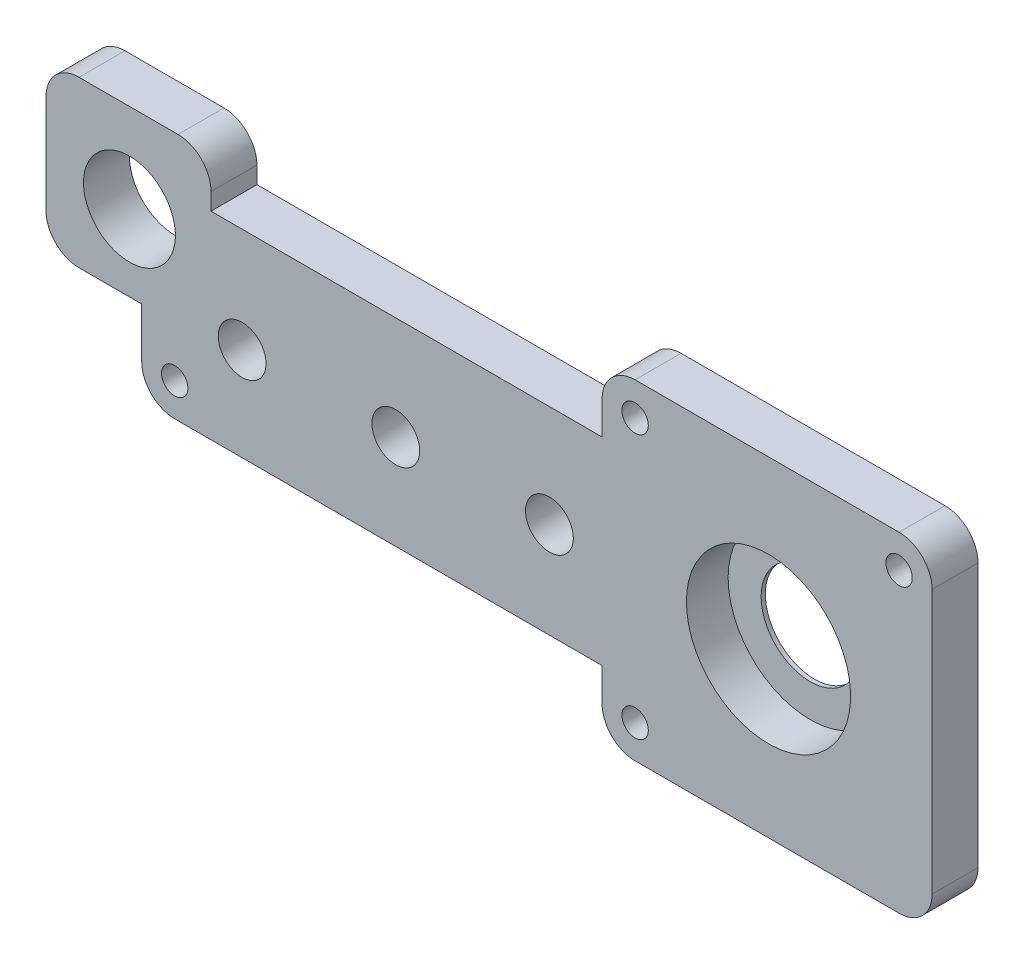
ISO-10303-21;
HEADER;
FILE_DESCRIPTION(('STEP AP214'),'2;1');
FILE_NAME('part.step','',(''),(''),'','','');
FILE_SCHEMA(('AUTOMOTIVE_DESIGN { 1 0 10303 214 1 1 1 1 }'));
ENDSEC;
DATA;
#1=APPLICATION_CONTEXT('core data for automotive mechanical design processes');
#2=APPLICATION_PROTOCOL_DEFINITION('international standard','automotive_design',2000,#1);
#3=PRODUCT_CONTEXT('',#1,'mechanical');
#4=PRODUCT('Part','Part','',(#3));
#5=PRODUCT_RELATED_PRODUCT_CATEGORY('part','',(#4));
#6=PRODUCT_DEFINITION_FORMATION('','',#4);
#7=PRODUCT_DEFINITION_CONTEXT('part definition',#1,'design');
#8=PRODUCT_DEFINITION('design','',#6,#7);
#9=PRODUCT_DEFINITION_SHAPE('','',#8);
#10=(LENGTH_UNIT() NAMED_UNIT(*) SI_UNIT(.MILLI.,.METRE.));
#11=(NAMED_UNIT(*) PLANE_ANGLE_UNIT() SI_UNIT($,.RADIAN.));
#12=(NAMED_UNIT(*) SI_UNIT($,.STERADIAN.) SOLID_ANGLE_UNIT());
#13=UNCERTAINTY_MEASURE_WITH_UNIT(LENGTH_MEASURE(1.E-05),#10,'distance_accuracy_value','');
#14=(GEOMETRIC_REPRESENTATION_CONTEXT(3) GLOBAL_UNCERTAINTY_ASSIGNED_CONTEXT((#13)) GLOBAL_UNIT_ASSIGNED_CONTEXT((#10,
#11,#12)) REPRESENTATION_CONTEXT('',''));
#15=CARTESIAN_POINT('',(0.,0.,0.));
#16=DIRECTION('',(0.,0.,1.));
#17=DIRECTION('',(1.,0.,0.));
#18=AXIS2_PLACEMENT_3D('',#15,#16,#17);
#19=CARTESIAN_POINT('',(-32.4507678390087,6.02727293338606,0.));
#20=DIRECTION('',(0.,0.,1.));
#21=DIRECTION('',(1.,0.,0.));
#22=AXIS2_PLACEMENT_3D('',#19,#20,#21);
#23=PLANE('',#22);
#24=CARTESIAN_POINT('',(36.9297953037845,7.56944328648019,0.));
#25=DIRECTION('',(0.,0.,-1.));
#26=DIRECTION('',(-1.,0.,0.));
#27=AXIS2_PLACEMENT_3D('',#24,#25,#26);
#28=CIRCLE('',#27,1.27000000000001);
#29=CARTESIAN_POINT('',(35.6597953037845,7.56944328648019,0.));
#30=VERTEX_POINT('',#29);
#31=EDGE_CURVE('E386',#30,#30,#28,.T.);
#32=ORIENTED_EDGE('',*,*,#31,.T.);
#33=EDGE_LOOP('',(#32));
#34=FACE_BOUND('',#33,.T.);
#35=CARTESIAN_POINT('',(11.5297953037845,-17.8305567135198,0.));
#36=DIRECTION('',(0.,0.,-1.));
#37=DIRECTION('',(-1.,0.,0.));
#38=AXIS2_PLACEMENT_3D('',#35,#36,#37);
#39=CIRCLE('',#38,1.27);
#40=CARTESIAN_POINT('',(10.2597953037845,-17.8305567135198,0.));
#41=VERTEX_POINT('',#40);
#42=EDGE_CURVE('E397',#41,#41,#39,.T.);
#43=ORIENTED_EDGE('',*,*,#42,.T.);
#44=EDGE_LOOP('',(#43));
#45=FACE_BOUND('',#44,.T.);
#46=CARTESIAN_POINT('',(3.28591546503794,-5.43259216122547,0.));
#47=DIRECTION('',(0.,0.,-1.));
#48=DIRECTION('',(-1.,0.,0.));
#49=AXIS2_PLACEMENT_3D('',#46,#47,#48);
#50=CIRCLE('',#49,2.2987);
#51=CARTESIAN_POINT('',(0.987215465037943,-5.43259216122547,0.));
#52=VERTEX_POINT('',#51);
#53=EDGE_CURVE('E409',#52,#52,#50,.T.);
#54=ORIENTED_EDGE('',*,*,#53,.T.);
#55=EDGE_LOOP('',(#54));
#56=FACE_BOUND('',#55,.T.);
#57=CARTESIAN_POINT('',(-26.278771935371,-5.66488997890497,0.));
#58=DIRECTION('',(0.,0.,-1.));
#59=DIRECTION('',(-1.,0.,0.));
#60=AXIS2_PLACEMENT_3D('',#57,#58,#59);
#61=CIRCLE('',#60,2.2987);
#62=CARTESIAN_POINT('',(-28.577471935371,-5.66488997890497,0.));
#63=VERTEX_POINT('',#62);
#64=EDGE_CURVE('E421',#63,#63,#61,.T.);
#65=ORIENTED_EDGE('',*,*,#64,.T.);
#66=EDGE_LOOP('',(#65));
#67=FACE_BOUND('',#66,.T.);
#68=CARTESIAN_POINT('',(-32.4507678390087,6.02727293338606,0.));
#69=DIRECTION('',(0.,0.,1.));
#70=DIRECTION('',(1.,0.,0.));
#71=AXIS2_PLACEMENT_3D('',#68,#69,#70);
#72=CIRCLE('',#71,3.175);
#73=CARTESIAN_POINT('',(-29.2757678390087,6.02727293338604,0.));
#74=VERTEX_POINT('',#73);
#75=CARTESIAN_POINT('',(-32.4507678390088,9.20227293338606,0.));
#76=VERTEX_POINT('',#75);
#77=EDGE_CURVE('E207',#74,#76,#72,.T.);
#78=ORIENTED_EDGE('',*,*,#77,.T.);
#79=DIRECTION('',(-1.,0.,0.));
#80=VECTOR('',#79,1.);
#81=CARTESIAN_POINT('',(-32.4507678390088,9.20227293338606,0.));
#82=LINE('',#81,#80);
#83=CARTESIAN_POINT('',(-41.9757678390087,9.20227293338606,0.));
#84=VERTEX_POINT('',#83);
#85=EDGE_CURVE('E210',#76,#84,#82,.T.);
#86=ORIENTED_EDGE('',*,*,#85,.T.);
#87=CARTESIAN_POINT('',(-41.9757678390087,6.02727293338606,0.));
#88=DIRECTION('',(0.,0.,1.));
#89=DIRECTION('',(1.,0.,0.));
#90=AXIS2_PLACEMENT_3D('',#87,#88,#89);
#91=CIRCLE('',#90,3.175);
#92=CARTESIAN_POINT('',(-45.1507678390087,6.02727293338604,0.));
#93=VERTEX_POINT('',#92);
#94=EDGE_CURVE('E214',#84,#93,#91,.T.);
#95=ORIENTED_EDGE('',*,*,#94,.T.);
#96=DIRECTION('',(0.,-1.,0.));
#97=VECTOR('',#96,1.);
#98=CARTESIAN_POINT('',(-45.1507678390087,6.02727293338604,0.));
#99=LINE('',#98,#97);
#100=CARTESIAN_POINT('',(-45.1507678390087,-3.49772706661392,0.));
#101=VERTEX_POINT('',#100);
#102=EDGE_CURVE('E217',#93,#101,#99,.T.);
#103=ORIENTED_EDGE('',*,*,#102,.T.);
#104=CARTESIAN_POINT('',(-41.9757678390087,-3.49772706661394,0.));
#105=DIRECTION('',(0.,0.,1.));
#106=DIRECTION('',(1.,0.,0.));
#107=AXIS2_PLACEMENT_3D('',#104,#105,#106);
#108=CIRCLE('',#107,3.175);
#109=CARTESIAN_POINT('',(-41.9757678390087,-6.67272706661394,0.));
#110=VERTEX_POINT('',#109);
#111=EDGE_CURVE('E220',#101,#110,#108,.T.);
#112=ORIENTED_EDGE('',*,*,#111,.T.);
#113=DIRECTION('',(1.,0.,0.));
#114=VECTOR('',#113,1.);
#115=CARTESIAN_POINT('',(-41.9757678390087,-6.67272706661394,0.));
#116=LINE('',#115,#114);
#117=CARTESIAN_POINT('',(-35.9428046962155,-6.67272706661394,0.));
#118=VERTEX_POINT('',#117);
#119=EDGE_CURVE('E223',#110,#118,#116,.T.);
#120=ORIENTED_EDGE('',*,*,#119,.T.);
#121=DIRECTION('',(0.,-1.,0.));
#122=VECTOR('',#121,1.);
#123=CARTESIAN_POINT('',(-35.9428046962155,-6.67272706661394,0.));
#124=LINE('',#123,#122);
#125=CARTESIAN_POINT('',(-35.9428046962155,-11.4805567135198,0.));
#126=VERTEX_POINT('',#125);
#127=EDGE_CURVE('E226',#118,#126,#124,.T.);
#128=ORIENTED_EDGE('',*,*,#127,.T.);
#129=CARTESIAN_POINT('',(-32.7678046962155,-11.4805567135198,0.));
#130=DIRECTION('',(0.,0.,1.));
#131=DIRECTION('',(1.,0.,0.));
#132=AXIS2_PLACEMENT_3D('',#129,#130,#131);
#133=CIRCLE('',#132,3.175);
#134=CARTESIAN_POINT('',(-32.7678046962155,-14.6555567135198,0.));
#135=VERTEX_POINT('',#134);
#136=EDGE_CURVE('E229',#126,#135,#133,.T.);
#137=ORIENTED_EDGE('',*,*,#136,.T.);
#138=DIRECTION('',(1.,0.,0.));
#139=VECTOR('',#138,1.);
#140=CARTESIAN_POINT('',(-32.7678046962155,-14.6555567135198,0.));
#141=LINE('',#140,#139);
#142=CARTESIAN_POINT('',(8.35479530378449,-14.6555567135198,0.));
#143=VERTEX_POINT('',#142);
#144=EDGE_CURVE('E232',#135,#143,#141,.T.);
#145=ORIENTED_EDGE('',*,*,#144,.T.);
#146=DIRECTION('',(0.,-1.,0.));
#147=VECTOR('',#146,1.);
#148=CARTESIAN_POINT('',(8.35479530378449,-14.6555567135198,0.));
#149=LINE('',#148,#147);
#150=CARTESIAN_POINT('',(8.3547953037845,-17.8305567135198,0.));
#151=VERTEX_POINT('',#150);
#152=EDGE_CURVE('E235',#143,#151,#149,.T.);
#153=ORIENTED_EDGE('',*,*,#152,.T.);
#154=CARTESIAN_POINT('',(11.5297953037845,-17.8305567135198,0.));
#155=DIRECTION('',(0.,0.,1.));
#156=DIRECTION('',(1.,0.,0.));
#157=AXIS2_PLACEMENT_3D('',#154,#155,#156);
#158=CIRCLE('',#157,3.175);
#159=CARTESIAN_POINT('',(11.5297953037845,-21.0055567135198,0.));
#160=VERTEX_POINT('',#159);
#161=EDGE_CURVE('E238',#151,#160,#158,.T.);
#162=ORIENTED_EDGE('',*,*,#161,.T.);
#163=DIRECTION('',(1.,0.,0.));
#164=VECTOR('',#163,1.);
#165=CARTESIAN_POINT('',(11.5297953037845,-21.0055567135198,0.));
#166=LINE('',#165,#164);
#167=CARTESIAN_POINT('',(36.9297953037845,-21.0055567135198,0.));
#168=VERTEX_POINT('',#167);
#169=EDGE_CURVE('E241',#160,#168,#166,.T.);
#170=ORIENTED_EDGE('',*,*,#169,.T.);
#171=CARTESIAN_POINT('',(36.9297953037845,-17.8305567135198,0.));
#172=DIRECTION('',(0.,0.,1.));
#173=DIRECTION('',(1.,0.,0.));
#174=AXIS2_PLACEMENT_3D('',#171,#172,#173);
#175=CIRCLE('',#174,3.175);
#176=CARTESIAN_POINT('',(40.1047953037845,-17.8305567135198,0.));
#177=VERTEX_POINT('',#176);
#178=EDGE_CURVE('E244',#168,#177,#175,.T.);
#179=ORIENTED_EDGE('',*,*,#178,.T.);
#180=DIRECTION('',(0.,1.,0.));
#181=VECTOR('',#180,1.);
#182=CARTESIAN_POINT('',(40.1047953037845,-17.8305567135198,0.));
#183=LINE('',#182,#181);
#184=CARTESIAN_POINT('',(40.1047953037845,7.56944328648017,0.));
#185=VERTEX_POINT('',#184);
#186=EDGE_CURVE('E247',#177,#185,#183,.T.);
#187=ORIENTED_EDGE('',*,*,#186,.T.);
#188=CARTESIAN_POINT('',(36.9297953037845,7.56944328648019,0.));
#189=DIRECTION('',(0.,0.,1.));
#190=DIRECTION('',(1.,0.,0.));
#191=AXIS2_PLACEMENT_3D('',#188,#189,#190);
#192=CIRCLE('',#191,3.175);
#193=CARTESIAN_POINT('',(36.9297953037845,10.7444432864802,0.));
#194=VERTEX_POINT('',#193);
#195=EDGE_CURVE('E250',#185,#194,#192,.T.);
#196=ORIENTED_EDGE('',*,*,#195,.T.);
#197=DIRECTION('',(-1.,0.,0.));
#198=VECTOR('',#197,1.);
#199=CARTESIAN_POINT('',(36.9297953037845,10.7444432864802,0.));
#200=LINE('',#199,#198);
#201=CARTESIAN_POINT('',(11.5297953037845,10.7444432864802,0.));
#202=VERTEX_POINT('',#201);
#203=EDGE_CURVE('E253',#194,#202,#200,.T.);
#204=ORIENTED_EDGE('',*,*,#203,.T.);
#205=CARTESIAN_POINT('',(11.5297953037845,7.56944328648019,0.));
#206=DIRECTION('',(0.,0.,1.));
#207=DIRECTION('',(1.,0.,0.));
#208=AXIS2_PLACEMENT_3D('',#205,#206,#207);
#209=CIRCLE('',#208,3.175);
#210=CARTESIAN_POINT('',(8.3547953037845,7.56944328648018,0.));
#211=VERTEX_POINT('',#210);
#212=EDGE_CURVE('E256',#202,#211,#209,.T.);
#213=ORIENTED_EDGE('',*,*,#212,.T.);
#214=DIRECTION('',(0.,-1.,0.));
#215=VECTOR('',#214,1.);
#216=CARTESIAN_POINT('',(8.3547953037845,7.56944328648018,0.));
#217=LINE('',#216,#215);
#218=CARTESIAN_POINT('',(8.3547953037845,4.39444328648021,0.));
#219=VERTEX_POINT('',#218);
#220=EDGE_CURVE('E259',#211,#219,#217,.T.);
#221=ORIENTED_EDGE('',*,*,#220,.T.);
#222=DIRECTION('',(-1.,0.,0.));
#223=VECTOR('',#222,1.);
#224=CARTESIAN_POINT('',(8.3547953037845,4.39444328648021,0.));
#225=LINE('',#224,#223);
#226=CARTESIAN_POINT('',(-29.2757678390087,4.39444328648021,0.));
#227=VERTEX_POINT('',#226);
#228=EDGE_CURVE('E183',#219,#227,#225,.T.);
#229=ORIENTED_EDGE('',*,*,#228,.T.);
#230=DIRECTION('',(0.,1.,0.));
#231=VECTOR('',#230,1.);
#232=CARTESIAN_POINT('',(-29.2757678390087,4.39444328648021,0.));
#233=LINE('',#232,#231);
#234=EDGE_CURVE('E262',#227,#74,#233,.T.);
#235=ORIENTED_EDGE('',*,*,#234,.T.);
#236=EDGE_LOOP('',(#78,#86,#95,#103,#112,#120,#128,#137,#145,#153,#162,#170,#179,#187,#196,#204,
#213,#221,#229,#235));
#237=FACE_BOUND('',#236,.T.);
#238=CARTESIAN_POINT('',(24.3672647282162,-5.26695024655708,0.));
#239=DIRECTION('',(0.,0.,-1.));
#240=DIRECTION('',(-1.,0.,0.));
#241=AXIS2_PLACEMENT_3D('',#238,#239,#240);
#242=CIRCLE('',#241,7.8994);
#243=CARTESIAN_POINT('',(16.4678647282162,-5.26695024655708,0.));
#244=VERTEX_POINT('',#243);
#245=EDGE_CURVE('E427',#244,#244,#242,.T.);
#246=ORIENTED_EDGE('',*,*,#245,.T.);
#247=EDGE_LOOP('',(#246));
#248=FACE_BOUND('',#247,.T.);
#249=CARTESIAN_POINT('',(-11.4964282351665,-5.54874107006524,0.));
#250=DIRECTION('',(0.,0.,-1.));
#251=DIRECTION('',(-1.,0.,0.));
#252=AXIS2_PLACEMENT_3D('',#249,#250,#251);
#253=CIRCLE('',#252,2.2987);
#254=CARTESIAN_POINT('',(-13.7951282351665,-5.54874107006524,0.));
#255=VERTEX_POINT('',#254);
#256=EDGE_CURVE('E415',#255,#255,#253,.T.);
#257=ORIENTED_EDGE('',*,*,#256,.T.);
#258=EDGE_LOOP('',(#257));
#259=FACE_BOUND('',#258,.T.);
#260=CARTESIAN_POINT('',(-32.7678046962155,-11.4805567135198,0.));
#261=DIRECTION('',(0.,0.,-1.));
#262=DIRECTION('',(-1.,0.,0.));
#263=AXIS2_PLACEMENT_3D('',#260,#261,#262);
#264=CIRCLE('',#263,1.27000000000001);
#265=CARTESIAN_POINT('',(-34.0378046962155,-11.4805567135198,0.));
#266=VERTEX_POINT('',#265);
#267=EDGE_CURVE('E403',#266,#266,#264,.T.);
#268=ORIENTED_EDGE('',*,*,#267,.T.);
#269=EDGE_LOOP('',(#268));
#270=FACE_BOUND('',#269,.T.);
#271=CARTESIAN_POINT('',(11.5297953037845,7.56944328648019,0.));
#272=DIRECTION('',(0.,0.,-1.));
#273=DIRECTION('',(-1.,0.,0.));
#274=AXIS2_PLACEMENT_3D('',#271,#272,#273);
#275=CIRCLE('',#274,1.27);
#276=CARTESIAN_POINT('',(10.2597953037845,7.56944328648019,0.));
#277=VERTEX_POINT('',#276);
#278=EDGE_CURVE('E392',#277,#277,#275,.T.);
#279=ORIENTED_EDGE('',*,*,#278,.T.);
#280=EDGE_LOOP('',(#279));
#281=FACE_BOUND('',#280,.T.);
#282=CARTESIAN_POINT('',(-37.1241501546406,0.645421981766471,0.));
#283=DIRECTION('',(0.,0.,-1.));
#284=DIRECTION('',(-1.,0.,0.));
#285=AXIS2_PLACEMENT_3D('',#282,#283,#284);
#286=CIRCLE('',#285,4.4196);
#287=CARTESIAN_POINT('',(-41.5437501546406,0.645421981766471,0.));
#288=VERTEX_POINT('',#287);
#289=EDGE_CURVE('E383',#288,#288,#286,.T.);
#290=ORIENTED_EDGE('',*,*,#289,.T.);
#291=EDGE_LOOP('',(#290));
#292=FACE_BOUND('',#291,.T.);
#293=ADVANCED_FACE('F35',(#34,#45,#56,#67,#237,#248,#259,#270,#281,#292),#23,.T.);
#294=CARTESIAN_POINT('',(-32.4507678390087,6.02727293338606,-4.4196));
#295=DIRECTION('',(0.,0.,1.));
#296=DIRECTION('',(1.,0.,0.));
#297=AXIS2_PLACEMENT_3D('',#294,#295,#296);
#298=PLANE('',#297);
#299=CARTESIAN_POINT('',(36.9297953037845,7.56944328648019,-4.4196));
#300=DIRECTION('',(0.,0.,-1.));
#301=DIRECTION('',(-1.,0.,0.));
#302=AXIS2_PLACEMENT_3D('',#299,#300,#301);
#303=CIRCLE('',#302,1.27000000000001);
#304=CARTESIAN_POINT('',(35.6597953037845,7.56944328648019,-4.4196));
#305=VERTEX_POINT('',#304);
#306=EDGE_CURVE('E389',#305,#305,#303,.T.);
#307=ORIENTED_EDGE('',*,*,#306,.F.);
#308=EDGE_LOOP('',(#307));
#309=FACE_BOUND('',#308,.T.);
#310=CARTESIAN_POINT('',(11.5297953037845,-17.8305567135198,-4.4196));
#311=DIRECTION('',(0.,0.,-1.));
#312=DIRECTION('',(-1.,0.,0.));
#313=AXIS2_PLACEMENT_3D('',#310,#311,#312);
#314=CIRCLE('',#313,1.27);
#315=CARTESIAN_POINT('',(10.2597953037845,-17.8305567135198,-4.4196));
#316=VERTEX_POINT('',#315);
#317=EDGE_CURVE('E400',#316,#316,#314,.T.);
#318=ORIENTED_EDGE('',*,*,#317,.F.);
#319=EDGE_LOOP('',(#318));
#320=FACE_BOUND('',#319,.T.);
#321=CARTESIAN_POINT('',(-32.4507678390087,6.02727293338606,-4.4196));
#322=DIRECTION('',(0.,0.,1.));
#323=DIRECTION('',(1.,0.,0.));
#324=AXIS2_PLACEMENT_3D('',#321,#322,#323);
#325=CIRCLE('',#324,3.175);
#326=CARTESIAN_POINT('',(-29.2757678390087,6.02727293338604,-4.4196));
#327=VERTEX_POINT('',#326);
#328=CARTESIAN_POINT('',(-32.4507678390088,9.20227293338606,-4.4196));
#329=VERTEX_POINT('',#328);
#330=EDGE_CURVE('E264',#327,#329,#325,.T.);
#331=ORIENTED_EDGE('',*,*,#330,.F.);
#332=DIRECTION('',(0.,1.,0.));
#333=VECTOR('',#332,1.);
#334=CARTESIAN_POINT('',(-29.2757678390087,4.39444328648021,-4.4196));
#335=LINE('',#334,#333);
#336=CARTESIAN_POINT('',(-29.2757678390087,4.39444328648021,-4.4196));
#337=VERTEX_POINT('',#336);
#338=EDGE_CURVE('E197',#337,#327,#335,.T.);
#339=ORIENTED_EDGE('',*,*,#338,.F.);
#340=DIRECTION('',(-1.,0.,0.));
#341=VECTOR('',#340,1.);
#342=CARTESIAN_POINT('',(8.3547953037845,4.39444328648021,-4.4196));
#343=LINE('',#342,#341);
#344=CARTESIAN_POINT('',(8.3547953037845,4.39444328648021,-4.4196));
#345=VERTEX_POINT('',#344);
#346=EDGE_CURVE('E181',#345,#337,#343,.T.);
#347=ORIENTED_EDGE('',*,*,#346,.F.);
#348=DIRECTION('',(0.,-1.,0.));
#349=VECTOR('',#348,1.);
#350=CARTESIAN_POINT('',(8.3547953037845,7.56944328648018,-4.4196));
#351=LINE('',#350,#349);
#352=CARTESIAN_POINT('',(8.3547953037845,7.56944328648018,-4.4196));
#353=VERTEX_POINT('',#352);
#354=EDGE_CURVE('E195',#353,#345,#351,.T.);
#355=ORIENTED_EDGE('',*,*,#354,.F.);
#356=CARTESIAN_POINT('',(11.5297953037845,7.56944328648019,-4.4196));
#357=DIRECTION('',(0.,0.,1.));
#358=DIRECTION('',(1.,0.,0.));
#359=AXIS2_PLACEMENT_3D('',#356,#357,#358);
#360=CIRCLE('',#359,3.175);
#361=CARTESIAN_POINT('',(11.5297953037845,10.7444432864802,-4.4196));
#362=VERTEX_POINT('',#361);
#363=EDGE_CURVE('E200',#362,#353,#360,.T.);
#364=ORIENTED_EDGE('',*,*,#363,.F.);
#365=DIRECTION('',(-1.,0.,0.));
#366=VECTOR('',#365,1.);
#367=CARTESIAN_POINT('',(36.9297953037845,10.7444432864802,-4.4196));
#368=LINE('',#367,#366);
#369=CARTESIAN_POINT('',(36.9297953037845,10.7444432864802,-4.4196));
#370=VERTEX_POINT('',#369);
#371=EDGE_CURVE('E202',#370,#362,#368,.T.);
#372=ORIENTED_EDGE('',*,*,#371,.F.);
#373=CARTESIAN_POINT('',(36.9297953037845,7.56944328648019,-4.4196));
#374=DIRECTION('',(0.,0.,1.));
#375=DIRECTION('',(1.,0.,0.));
#376=AXIS2_PLACEMENT_3D('',#373,#374,#375);
#377=CIRCLE('',#376,3.175);
#378=CARTESIAN_POINT('',(40.1047953037845,7.56944328648017,-4.4196));
#379=VERTEX_POINT('',#378);
#380=EDGE_CURVE('E476',#379,#370,#377,.T.);
#381=ORIENTED_EDGE('',*,*,#380,.F.);
#382=DIRECTION('',(0.,1.,0.));
#383=VECTOR('',#382,1.);
#384=CARTESIAN_POINT('',(40.1047953037845,-17.8305567135198,-4.4196));
#385=LINE('',#384,#383);
#386=CARTESIAN_POINT('',(40.1047953037845,-17.8305567135198,-4.4196));
#387=VERTEX_POINT('',#386);
#388=EDGE_CURVE('E473',#387,#379,#385,.T.);
#389=ORIENTED_EDGE('',*,*,#388,.F.);
#390=CARTESIAN_POINT('',(36.9297953037845,-17.8305567135198,-4.4196));
#391=DIRECTION('',(0.,0.,1.));
#392=DIRECTION('',(1.,0.,0.));
#393=AXIS2_PLACEMENT_3D('',#390,#391,#392);
#394=CIRCLE('',#393,3.175);
#395=CARTESIAN_POINT('',(36.9297953037845,-21.0055567135198,-4.4196));
#396=VERTEX_POINT('',#395);
#397=EDGE_CURVE('E470',#396,#387,#394,.T.);
#398=ORIENTED_EDGE('',*,*,#397,.F.);
#399=DIRECTION('',(1.,0.,0.));
#400=VECTOR('',#399,1.);
#401=CARTESIAN_POINT('',(11.5297953037845,-21.0055567135198,-4.4196));
#402=LINE('',#401,#400);
#403=CARTESIAN_POINT('',(11.5297953037845,-21.0055567135198,-4.4196));
#404=VERTEX_POINT('',#403);
#405=EDGE_CURVE('E467',#404,#396,#402,.T.);
#406=ORIENTED_EDGE('',*,*,#405,.F.);
#407=CARTESIAN_POINT('',(11.5297953037845,-17.8305567135198,-4.4196));
#408=DIRECTION('',(0.,0.,1.));
#409=DIRECTION('',(1.,0.,0.));
#410=AXIS2_PLACEMENT_3D('',#407,#408,#409);
#411=CIRCLE('',#410,3.175);
#412=CARTESIAN_POINT('',(8.3547953037845,-17.8305567135198,-4.4196));
#413=VERTEX_POINT('',#412);
#414=EDGE_CURVE('E464',#413,#404,#411,.T.);
#415=ORIENTED_EDGE('',*,*,#414,.F.);
#416=DIRECTION('',(0.,-1.,0.));
#417=VECTOR('',#416,1.);
#418=CARTESIAN_POINT('',(8.35479530378449,-14.6555567135198,-4.4196));
#419=LINE('',#418,#417);
#420=CARTESIAN_POINT('',(8.35479530378449,-14.6555567135198,-4.4196));
#421=VERTEX_POINT('',#420);
#422=EDGE_CURVE('E461',#421,#413,#419,.T.);
#423=ORIENTED_EDGE('',*,*,#422,.F.);
#424=DIRECTION('',(1.,0.,0.));
#425=VECTOR('',#424,1.);
#426=CARTESIAN_POINT('',(-32.7678046962155,-14.6555567135198,-4.4196));
#427=LINE('',#426,#425);
#428=CARTESIAN_POINT('',(-32.7678046962155,-14.6555567135198,-4.4196));
#429=VERTEX_POINT('',#428);
#430=EDGE_CURVE('E458',#429,#421,#427,.T.);
#431=ORIENTED_EDGE('',*,*,#430,.F.);
#432=CARTESIAN_POINT('',(-32.7678046962155,-11.4805567135198,-4.4196));
#433=DIRECTION('',(0.,0.,1.));
#434=DIRECTION('',(1.,0.,0.));
#435=AXIS2_PLACEMENT_3D('',#432,#433,#434);
#436=CIRCLE('',#435,3.175);
#437=CARTESIAN_POINT('',(-35.9428046962155,-11.4805567135198,-4.4196));
#438=VERTEX_POINT('',#437);
#439=EDGE_CURVE('E455',#438,#429,#436,.T.);
#440=ORIENTED_EDGE('',*,*,#439,.F.);
#441=DIRECTION('',(0.,-1.,0.));
#442=VECTOR('',#441,1.);
#443=CARTESIAN_POINT('',(-35.9428046962155,-6.67272706661394,-4.4196));
#444=LINE('',#443,#442);
#445=CARTESIAN_POINT('',(-35.9428046962155,-6.67272706661394,-4.4196));
#446=VERTEX_POINT('',#445);
#447=EDGE_CURVE('E452',#446,#438,#444,.T.);
#448=ORIENTED_EDGE('',*,*,#447,.F.);
#449=DIRECTION('',(1.,0.,0.));
#450=VECTOR('',#449,1.);
#451=CARTESIAN_POINT('',(-41.9757678390087,-6.67272706661394,-4.4196));
#452=LINE('',#451,#450);
#453=CARTESIAN_POINT('',(-41.9757678390087,-6.67272706661394,-4.4196));
#454=VERTEX_POINT('',#453);
#455=EDGE_CURVE('E449',#454,#446,#452,.T.);
#456=ORIENTED_EDGE('',*,*,#455,.F.);
#457=CARTESIAN_POINT('',(-41.9757678390087,-3.49772706661394,-4.4196));
#458=DIRECTION('',(0.,0.,1.));
#459=DIRECTION('',(1.,0.,0.));
#460=AXIS2_PLACEMENT_3D('',#457,#458,#459);
#461=CIRCLE('',#460,3.175);
#462=CARTESIAN_POINT('',(-45.1507678390087,-3.49772706661392,-4.4196));
#463=VERTEX_POINT('',#462);
#464=EDGE_CURVE('E446',#463,#454,#461,.T.);
#465=ORIENTED_EDGE('',*,*,#464,.F.);
#466=DIRECTION('',(0.,-1.,0.));
#467=VECTOR('',#466,1.);
#468=CARTESIAN_POINT('',(-45.1507678390087,6.02727293338604,-4.4196));
#469=LINE('',#468,#467);
#470=CARTESIAN_POINT('',(-45.1507678390087,6.02727293338604,-4.4196));
#471=VERTEX_POINT('',#470);
#472=EDGE_CURVE('E443',#471,#463,#469,.T.);
#473=ORIENTED_EDGE('',*,*,#472,.F.);
#474=CARTESIAN_POINT('',(-41.9757678390087,6.02727293338606,-4.4196));
#475=DIRECTION('',(0.,0.,1.));
#476=DIRECTION('',(1.,0.,0.));
#477=AXIS2_PLACEMENT_3D('',#474,#475,#476);
#478=CIRCLE('',#477,3.175);
#479=CARTESIAN_POINT('',(-41.9757678390087,9.20227293338606,-4.4196));
#480=VERTEX_POINT('',#479);
#481=EDGE_CURVE('E440',#480,#471,#478,.T.);
#482=ORIENTED_EDGE('',*,*,#481,.F.);
#483=DIRECTION('',(-1.,0.,0.));
#484=VECTOR('',#483,1.);
#485=CARTESIAN_POINT('',(-32.4507678390088,9.20227293338606,-4.4196));
#486=LINE('',#485,#484);
#487=EDGE_CURVE('E438',#329,#480,#486,.T.);
#488=ORIENTED_EDGE('',*,*,#487,.F.);
#489=EDGE_LOOP('',(#331,#339,#347,#355,#364,#372,#381,#389,#398,#406,#415,#423,#431,#440,#448,
#456,#465,#473,#482,#488));
#490=FACE_BOUND('',#489,.T.);
#491=CARTESIAN_POINT('',(24.3672647282162,-5.26695024655709,-4.4196));
#492=DIRECTION('',(0.,0.,1.));
#493=DIRECTION('',(1.,0.,0.));
#494=AXIS2_PLACEMENT_3D('',#491,#492,#493);
#495=CIRCLE('',#494,4.72439999999999);
#496=CARTESIAN_POINT('',(29.0916647282162,-5.26695024655709,-4.4196));
#497=VERTEX_POINT('',#496);
#498=EDGE_CURVE('E211',#497,#497,#495,.T.);
#499=ORIENTED_EDGE('',*,*,#498,.T.);
#500=EDGE_LOOP('',(#499));
#501=FACE_BOUND('',#500,.T.);
#502=CARTESIAN_POINT('',(-32.7678046962155,-11.4805567135198,-4.4196));
#503=DIRECTION('',(0.,0.,-1.));
#504=DIRECTION('',(-1.,0.,0.));
#505=AXIS2_PLACEMENT_3D('',#502,#503,#504);
#506=CIRCLE('',#505,1.27000000000001);
#507=CARTESIAN_POINT('',(-34.0378046962155,-11.4805567135198,-4.4196));
#508=VERTEX_POINT('',#507);
#509=EDGE_CURVE('E406',#508,#508,#506,.T.);
#510=ORIENTED_EDGE('',*,*,#509,.F.);
#511=EDGE_LOOP('',(#510));
#512=FACE_BOUND('',#511,.T.);
#513=CARTESIAN_POINT('',(11.5297953037845,7.56944328648019,-4.4196));
#514=DIRECTION('',(0.,0.,-1.));
#515=DIRECTION('',(-1.,0.,0.));
#516=AXIS2_PLACEMENT_3D('',#513,#514,#515);
#517=CIRCLE('',#516,1.27);
#518=CARTESIAN_POINT('',(10.2597953037845,7.56944328648019,-4.4196));
#519=VERTEX_POINT('',#518);
#520=EDGE_CURVE('E394',#519,#519,#517,.T.);
#521=ORIENTED_EDGE('',*,*,#520,.F.);
#522=EDGE_LOOP('',(#521));
#523=FACE_BOUND('',#522,.T.);
#524=CARTESIAN_POINT('',(-37.1241501546406,0.645421981766471,-4.4196));
#525=DIRECTION('',(0.,0.,-1.));
#526=DIRECTION('',(-1.,0.,0.));
#527=AXIS2_PLACEMENT_3D('',#524,#525,#526);
#528=CIRCLE('',#527,4.4196);
#529=CARTESIAN_POINT('',(-41.5437501546406,0.645421981766471,-4.4196));
#530=VERTEX_POINT('',#529);
#531=EDGE_CURVE('E380',#530,#530,#528,.T.);
#532=ORIENTED_EDGE('',*,*,#531,.F.);
#533=EDGE_LOOP('',(#532));
#534=FACE_BOUND('',#533,.T.);
#535=ADVANCED_FACE('F192',(#309,#320,#490,#501,#512,#523,#534),#298,.F.);
#536=CARTESIAN_POINT('',(-32.4507678390087,6.02727293338606,-4.4196));
#537=DIRECTION('',(0.,0.,1.));
#538=DIRECTION('',(1.,0.,0.));
#539=AXIS2_PLACEMENT_3D('',#536,#537,#538);
#540=CYLINDRICAL_SURFACE('',#539,3.175);
#541=ORIENTED_EDGE('',*,*,#77,.F.);
#542=DIRECTION('',(0.,0.,1.));
#543=VECTOR('',#542,1.);
#544=CARTESIAN_POINT('',(-29.2757678390087,6.02727293338604,-4.4196));
#545=LINE('',#544,#543);
#546=EDGE_CURVE('E11',#327,#74,#545,.T.);
#547=ORIENTED_EDGE('',*,*,#546,.F.);
#548=ORIENTED_EDGE('',*,*,#330,.T.);
#549=DIRECTION('',(0.,0.,1.));
#550=VECTOR('',#549,1.);
#551=CARTESIAN_POINT('',(-32.4507678390088,9.20227293338606,-4.4196));
#552=LINE('',#551,#550);
#553=EDGE_CURVE('E128',#329,#76,#552,.T.);
#554=ORIENTED_EDGE('',*,*,#553,.T.);
#555=EDGE_LOOP('',(#541,#547,#548,#554));
#556=FACE_BOUND('',#555,.T.);
#557=ADVANCED_FACE('F37',(#556),#540,.T.);
#558=CARTESIAN_POINT('',(-29.2757678390087,4.39444328648021,-4.4196));
#559=DIRECTION('',(1.,0.,0.));
#560=DIRECTION('',(0.,0.,-1.));
#561=AXIS2_PLACEMENT_3D('',#558,#559,#560);
#562=PLANE('',#561);
#563=ORIENTED_EDGE('',*,*,#234,.F.);
#564=DIRECTION('',(0.,0.,1.));
#565=VECTOR('',#564,1.);
#566=CARTESIAN_POINT('',(-29.2757678390087,4.39444328648021,-4.4196));
#567=LINE('',#566,#565);
#568=EDGE_CURVE('E45',#337,#227,#567,.T.);
#569=ORIENTED_EDGE('',*,*,#568,.F.);
#570=ORIENTED_EDGE('',*,*,#338,.T.);
#571=ORIENTED_EDGE('',*,*,#546,.T.);
#572=EDGE_LOOP('',(#563,#569,#570,#571));
#573=FACE_BOUND('',#572,.T.);
#574=ADVANCED_FACE('F301',(#573),#562,.T.);
#575=CARTESIAN_POINT('',(8.3547953037845,4.39444328648021,-4.4196));
#576=DIRECTION('',(0.,1.,0.));
#577=DIRECTION('',(0.,0.,1.));
#578=AXIS2_PLACEMENT_3D('',#575,#576,#577);
#579=PLANE('',#578);
#580=ORIENTED_EDGE('',*,*,#228,.F.);
#581=DIRECTION('',(0.,0.,1.));
#582=VECTOR('',#581,1.);
#583=CARTESIAN_POINT('',(8.3547953037845,4.39444328648021,-4.4196));
#584=LINE('',#583,#582);
#585=EDGE_CURVE('E178',#345,#219,#584,.T.);
#586=ORIENTED_EDGE('',*,*,#585,.F.);
#587=ORIENTED_EDGE('',*,*,#346,.T.);
#588=ORIENTED_EDGE('',*,*,#568,.T.);
#589=EDGE_LOOP('',(#580,#586,#587,#588));
#590=FACE_BOUND('',#589,.T.);
#591=ADVANCED_FACE('F180',(#590),#579,.T.);
#592=CARTESIAN_POINT('',(8.3547953037845,7.56944328648018,-4.4196));
#593=DIRECTION('',(-1.,0.,0.));
#594=DIRECTION('',(0.,0.,1.));
#595=AXIS2_PLACEMENT_3D('',#592,#593,#594);
#596=PLANE('',#595);
#597=ORIENTED_EDGE('',*,*,#220,.F.);
#598=DIRECTION('',(0.,0.,1.));
#599=VECTOR('',#598,1.);
#600=CARTESIAN_POINT('',(8.3547953037845,7.56944328648018,-4.4196));
#601=LINE('',#600,#599);
#602=EDGE_CURVE('E188',#353,#211,#601,.T.);
#603=ORIENTED_EDGE('',*,*,#602,.F.);
#604=ORIENTED_EDGE('',*,*,#354,.T.);
#605=ORIENTED_EDGE('',*,*,#585,.T.);
#606=EDGE_LOOP('',(#597,#603,#604,#605));
#607=FACE_BOUND('',#606,.T.);
#608=ADVANCED_FACE('F199',(#607),#596,.T.);
#609=CARTESIAN_POINT('',(11.5297953037845,7.56944328648019,-4.4196));
#610=DIRECTION('',(0.,0.,1.));
#611=DIRECTION('',(1.,0.,0.));
#612=AXIS2_PLACEMENT_3D('',#609,#610,#611);
#613=CYLINDRICAL_SURFACE('',#612,3.175);
#614=ORIENTED_EDGE('',*,*,#212,.F.);
#615=DIRECTION('',(0.,0.,1.));
#616=VECTOR('',#615,1.);
#617=CARTESIAN_POINT('',(11.5297953037845,10.7444432864802,-4.4196));
#618=LINE('',#617,#616);
#619=EDGE_CURVE('E268',#362,#202,#618,.T.);
#620=ORIENTED_EDGE('',*,*,#619,.F.);
#621=ORIENTED_EDGE('',*,*,#363,.T.);
#622=ORIENTED_EDGE('',*,*,#602,.T.);
#623=EDGE_LOOP('',(#614,#620,#621,#622));
#624=FACE_BOUND('',#623,.T.);
#625=ADVANCED_FACE('F536',(#624),#613,.T.);
#626=CARTESIAN_POINT('',(36.9297953037845,10.7444432864802,-4.4196));
#627=DIRECTION('',(0.,1.,0.));
#628=DIRECTION('',(-1.,0.,0.));
#629=AXIS2_PLACEMENT_3D('',#626,#627,#628);
#630=PLANE('',#629);
#631=ORIENTED_EDGE('',*,*,#203,.F.);
#632=DIRECTION('',(0.,0.,1.));
#633=VECTOR('',#632,1.);
#634=CARTESIAN_POINT('',(36.9297953037845,10.7444432864802,-4.4196));
#635=LINE('',#634,#633);
#636=EDGE_CURVE('E270',#370,#194,#635,.T.);
#637=ORIENTED_EDGE('',*,*,#636,.F.);
#638=ORIENTED_EDGE('',*,*,#371,.T.);
#639=ORIENTED_EDGE('',*,*,#619,.T.);
#640=EDGE_LOOP('',(#631,#637,#638,#639));
#641=FACE_BOUND('',#640,.T.);
#642=ADVANCED_FACE('F482',(#641),#630,.T.);
#643=CARTESIAN_POINT('',(36.9297953037845,7.56944328648019,-4.4196));
#644=DIRECTION('',(0.,0.,1.));
#645=DIRECTION('',(1.,0.,0.));
#646=AXIS2_PLACEMENT_3D('',#643,#644,#645);
#647=CYLINDRICAL_SURFACE('',#646,3.175);
#648=ORIENTED_EDGE('',*,*,#195,.F.);
#649=DIRECTION('',(0.,0.,1.));
#650=VECTOR('',#649,1.);
#651=CARTESIAN_POINT('',(40.1047953037845,7.56944328648017,-4.4196));
#652=LINE('',#651,#650);
#653=EDGE_CURVE('E272',#379,#185,#652,.T.);
#654=ORIENTED_EDGE('',*,*,#653,.F.);
#655=ORIENTED_EDGE('',*,*,#380,.T.);
#656=ORIENTED_EDGE('',*,*,#636,.T.);
#657=EDGE_LOOP('',(#648,#654,#655,#656));
#658=FACE_BOUND('',#657,.T.);
#659=ADVANCED_FACE('F488',(#658),#647,.T.);
#660=CARTESIAN_POINT('',(40.1047953037845,-17.8305567135198,-4.4196));
#661=DIRECTION('',(1.,0.,0.));
#662=DIRECTION('',(0.,0.,-1.));
#663=AXIS2_PLACEMENT_3D('',#660,#661,#662);
#664=PLANE('',#663);
#665=ORIENTED_EDGE('',*,*,#186,.F.);
#666=DIRECTION('',(0.,0.,1.));
#667=VECTOR('',#666,1.);
#668=CARTESIAN_POINT('',(40.1047953037845,-17.8305567135198,-4.4196));
#669=LINE('',#668,#667);
#670=EDGE_CURVE('E274',#387,#177,#669,.T.);
#671=ORIENTED_EDGE('',*,*,#670,.F.);
#672=ORIENTED_EDGE('',*,*,#388,.T.);
#673=ORIENTED_EDGE('',*,*,#653,.T.);
#674=EDGE_LOOP('',(#665,#671,#672,#673));
#675=FACE_BOUND('',#674,.T.);
#676=ADVANCED_FACE('F491',(#675),#664,.T.);
#677=CARTESIAN_POINT('',(36.9297953037845,-17.8305567135198,-4.4196));
#678=DIRECTION('',(0.,0.,1.));
#679=DIRECTION('',(1.,0.,0.));
#680=AXIS2_PLACEMENT_3D('',#677,#678,#679);
#681=CYLINDRICAL_SURFACE('',#680,3.175);
#682=ORIENTED_EDGE('',*,*,#178,.F.);
#683=DIRECTION('',(0.,0.,1.));
#684=VECTOR('',#683,1.);
#685=CARTESIAN_POINT('',(36.9297953037845,-21.0055567135198,-4.4196));
#686=LINE('',#685,#684);
#687=EDGE_CURVE('E276',#396,#168,#686,.T.);
#688=ORIENTED_EDGE('',*,*,#687,.F.);
#689=ORIENTED_EDGE('',*,*,#397,.T.);
#690=ORIENTED_EDGE('',*,*,#670,.T.);
#691=EDGE_LOOP('',(#682,#688,#689,#690));
#692=FACE_BOUND('',#691,.T.);
#693=ADVANCED_FACE('F496',(#692),#681,.T.);
#694=CARTESIAN_POINT('',(11.5297953037845,-21.0055567135198,-4.4196));
#695=DIRECTION('',(0.,-1.,0.));
#696=DIRECTION('',(0.,0.,-1.));
#697=AXIS2_PLACEMENT_3D('',#694,#695,#696);
#698=PLANE('',#697);
#699=ORIENTED_EDGE('',*,*,#169,.F.);
#700=DIRECTION('',(0.,0.,1.));
#701=VECTOR('',#700,1.);
#702=CARTESIAN_POINT('',(11.5297953037845,-21.0055567135198,-4.4196));
#703=LINE('',#702,#701);
#704=EDGE_CURVE('E278',#404,#160,#703,.T.);
#705=ORIENTED_EDGE('',*,*,#704,.F.);
#706=ORIENTED_EDGE('',*,*,#405,.T.);
#707=ORIENTED_EDGE('',*,*,#687,.T.);
#708=EDGE_LOOP('',(#699,#705,#706,#707));
#709=FACE_BOUND('',#708,.T.);
#710=ADVANCED_FACE('F499',(#709),#698,.T.);
#711=CARTESIAN_POINT('',(11.5297953037845,-17.8305567135198,-4.4196));
#712=DIRECTION('',(0.,0.,1.));
#713=DIRECTION('',(1.,0.,0.));
#714=AXIS2_PLACEMENT_3D('',#711,#712,#713);
#715=CYLINDRICAL_SURFACE('',#714,3.175);
#716=ORIENTED_EDGE('',*,*,#161,.F.);
#717=DIRECTION('',(0.,0.,1.));
#718=VECTOR('',#717,1.);
#719=CARTESIAN_POINT('',(8.3547953037845,-17.8305567135198,-4.4196));
#720=LINE('',#719,#718);
#721=EDGE_CURVE('E280',#413,#151,#720,.T.);
#722=ORIENTED_EDGE('',*,*,#721,.F.);
#723=ORIENTED_EDGE('',*,*,#414,.T.);
#724=ORIENTED_EDGE('',*,*,#704,.T.);
#725=EDGE_LOOP('',(#716,#722,#723,#724));
#726=FACE_BOUND('',#725,.T.);
#727=ADVANCED_FACE('F504',(#726),#715,.T.);
#728=CARTESIAN_POINT('',(8.35479530378449,-14.6555567135198,-4.4196));
#729=DIRECTION('',(-1.,0.,0.));
#730=DIRECTION('',(0.,-1.,0.));
#731=AXIS2_PLACEMENT_3D('',#728,#729,#730);
#732=PLANE('',#731);
#733=ORIENTED_EDGE('',*,*,#152,.F.);
#734=DIRECTION('',(0.,0.,1.));
#735=VECTOR('',#734,1.);
#736=CARTESIAN_POINT('',(8.35479530378449,-14.6555567135198,-4.4196));
#737=LINE('',#736,#735);
#738=EDGE_CURVE('E282',#421,#143,#737,.T.);
#739=ORIENTED_EDGE('',*,*,#738,.F.);
#740=ORIENTED_EDGE('',*,*,#422,.T.);
#741=ORIENTED_EDGE('',*,*,#721,.T.);
#742=EDGE_LOOP('',(#733,#739,#740,#741));
#743=FACE_BOUND('',#742,.T.);
#744=ADVANCED_FACE('F507',(#743),#732,.T.);
#745=CARTESIAN_POINT('',(-32.7678046962155,-14.6555567135198,-4.4196));
#746=DIRECTION('',(0.,-1.,0.));
#747=DIRECTION('',(0.,0.,-1.));
#748=AXIS2_PLACEMENT_3D('',#745,#746,#747);
#749=PLANE('',#748);
#750=ORIENTED_EDGE('',*,*,#144,.F.);
#751=DIRECTION('',(0.,0.,1.));
#752=VECTOR('',#751,1.);
#753=CARTESIAN_POINT('',(-32.7678046962155,-14.6555567135198,-4.4196));
#754=LINE('',#753,#752);
#755=EDGE_CURVE('E284',#429,#135,#754,.T.);
#756=ORIENTED_EDGE('',*,*,#755,.F.);
#757=ORIENTED_EDGE('',*,*,#430,.T.);
#758=ORIENTED_EDGE('',*,*,#738,.T.);
#759=EDGE_LOOP('',(#750,#756,#757,#758));
#760=FACE_BOUND('',#759,.T.);
#761=ADVANCED_FACE('F512',(#760),#749,.T.);
#762=CARTESIAN_POINT('',(-32.7678046962155,-11.4805567135198,-4.4196));
#763=DIRECTION('',(0.,0.,1.));
#764=DIRECTION('',(1.,0.,0.));
#765=AXIS2_PLACEMENT_3D('',#762,#763,#764);
#766=CYLINDRICAL_SURFACE('',#765,3.175);
#767=ORIENTED_EDGE('',*,*,#136,.F.);
#768=DIRECTION('',(0.,0.,1.));
#769=VECTOR('',#768,1.);
#770=CARTESIAN_POINT('',(-35.9428046962155,-11.4805567135198,-4.4196));
#771=LINE('',#770,#769);
#772=EDGE_CURVE('E286',#438,#126,#771,.T.);
#773=ORIENTED_EDGE('',*,*,#772,.F.);
#774=ORIENTED_EDGE('',*,*,#439,.T.);
#775=ORIENTED_EDGE('',*,*,#755,.T.);
#776=EDGE_LOOP('',(#767,#773,#774,#775));
#777=FACE_BOUND('',#776,.T.);
#778=ADVANCED_FACE('F515',(#777),#766,.T.);
#779=CARTESIAN_POINT('',(-35.9428046962155,-6.67272706661394,-4.4196));
#780=DIRECTION('',(-1.,0.,0.));
#781=DIRECTION('',(0.,0.,1.));
#782=AXIS2_PLACEMENT_3D('',#779,#780,#781);
#783=PLANE('',#782);
#784=ORIENTED_EDGE('',*,*,#127,.F.);
#785=DIRECTION('',(0.,0.,1.));
#786=VECTOR('',#785,1.);
#787=CARTESIAN_POINT('',(-35.9428046962155,-6.67272706661394,-4.4196));
#788=LINE('',#787,#786);
#789=EDGE_CURVE('E288',#446,#118,#788,.T.);
#790=ORIENTED_EDGE('',*,*,#789,.F.);
#791=ORIENTED_EDGE('',*,*,#447,.T.);
#792=ORIENTED_EDGE('',*,*,#772,.T.);
#793=EDGE_LOOP('',(#784,#790,#791,#792));
#794=FACE_BOUND('',#793,.T.);
#795=ADVANCED_FACE('F520',(#794),#783,.T.);
#796=CARTESIAN_POINT('',(-41.9757678390087,-6.67272706661394,-4.4196));
#797=DIRECTION('',(0.,-1.,0.));
#798=DIRECTION('',(1.,0.,0.));
#799=AXIS2_PLACEMENT_3D('',#796,#797,#798);
#800=PLANE('',#799);
#801=ORIENTED_EDGE('',*,*,#119,.F.);
#802=DIRECTION('',(0.,0.,1.));
#803=VECTOR('',#802,1.);
#804=CARTESIAN_POINT('',(-41.9757678390087,-6.67272706661394,-4.4196));
#805=LINE('',#804,#803);
#806=EDGE_CURVE('E290',#454,#110,#805,.T.);
#807=ORIENTED_EDGE('',*,*,#806,.F.);
#808=ORIENTED_EDGE('',*,*,#455,.T.);
#809=ORIENTED_EDGE('',*,*,#789,.T.);
#810=EDGE_LOOP('',(#801,#807,#808,#809));
#811=FACE_BOUND('',#810,.T.);
#812=ADVANCED_FACE('F523',(#811),#800,.T.);
#813=CARTESIAN_POINT('',(-41.9757678390087,-3.49772706661394,-4.4196));
#814=DIRECTION('',(0.,0.,1.));
#815=DIRECTION('',(1.,0.,0.));
#816=AXIS2_PLACEMENT_3D('',#813,#814,#815);
#817=CYLINDRICAL_SURFACE('',#816,3.175);
#818=ORIENTED_EDGE('',*,*,#111,.F.);
#819=DIRECTION('',(0.,0.,1.));
#820=VECTOR('',#819,1.);
#821=CARTESIAN_POINT('',(-45.1507678390087,-3.49772706661392,-4.4196));
#822=LINE('',#821,#820);
#823=EDGE_CURVE('E292',#463,#101,#822,.T.);
#824=ORIENTED_EDGE('',*,*,#823,.F.);
#825=ORIENTED_EDGE('',*,*,#464,.T.);
#826=ORIENTED_EDGE('',*,*,#806,.T.);
#827=EDGE_LOOP('',(#818,#824,#825,#826));
#828=FACE_BOUND('',#827,.T.);
#829=ADVANCED_FACE('F528',(#828),#817,.T.);
#830=CARTESIAN_POINT('',(-45.1507678390087,6.02727293338604,-4.4196));
#831=DIRECTION('',(-1.,0.,0.));
#832=DIRECTION('',(0.,0.,1.));
#833=AXIS2_PLACEMENT_3D('',#830,#831,#832);
#834=PLANE('',#833);
#835=ORIENTED_EDGE('',*,*,#102,.F.);
#836=DIRECTION('',(0.,0.,1.));
#837=VECTOR('',#836,1.);
#838=CARTESIAN_POINT('',(-45.1507678390087,6.02727293338604,-4.4196));
#839=LINE('',#838,#837);
#840=EDGE_CURVE('E294',#471,#93,#839,.T.);
#841=ORIENTED_EDGE('',*,*,#840,.F.);
#842=ORIENTED_EDGE('',*,*,#472,.T.);
#843=ORIENTED_EDGE('',*,*,#823,.T.);
#844=EDGE_LOOP('',(#835,#841,#842,#843));
#845=FACE_BOUND('',#844,.T.);
#846=ADVANCED_FACE('F531',(#845),#834,.T.);
#847=CARTESIAN_POINT('',(-41.9757678390087,6.02727293338606,-4.4196));
#848=DIRECTION('',(0.,0.,1.));
#849=DIRECTION('',(1.,0.,0.));
#850=AXIS2_PLACEMENT_3D('',#847,#848,#849);
#851=CYLINDRICAL_SURFACE('',#850,3.175);
#852=ORIENTED_EDGE('',*,*,#94,.F.);
#853=DIRECTION('',(0.,0.,1.));
#854=VECTOR('',#853,1.);
#855=CARTESIAN_POINT('',(-41.9757678390087,9.20227293338606,-4.4196));
#856=LINE('',#855,#854);
#857=EDGE_CURVE('E296',#480,#84,#856,.T.);
#858=ORIENTED_EDGE('',*,*,#857,.F.);
#859=ORIENTED_EDGE('',*,*,#481,.T.);
#860=ORIENTED_EDGE('',*,*,#840,.T.);
#861=EDGE_LOOP('',(#852,#858,#859,#860));
#862=FACE_BOUND('',#861,.T.);
#863=ADVANCED_FACE('F534',(#862),#851,.T.);
#864=CARTESIAN_POINT('',(-32.4507678390088,9.20227293338606,-4.4196));
#865=DIRECTION('',(0.,1.,0.));
#866=DIRECTION('',(-1.,0.,0.));
#867=AXIS2_PLACEMENT_3D('',#864,#865,#866);
#868=PLANE('',#867);
#869=ORIENTED_EDGE('',*,*,#85,.F.);
#870=ORIENTED_EDGE('',*,*,#553,.F.);
#871=ORIENTED_EDGE('',*,*,#487,.T.);
#872=ORIENTED_EDGE('',*,*,#857,.T.);
#873=EDGE_LOOP('',(#869,#870,#871,#872));
#874=FACE_BOUND('',#873,.T.);
#875=ADVANCED_FACE('F297',(#874),#868,.T.);
#876=CARTESIAN_POINT('',(24.3672647282162,-5.26695024655709,-4.4196));
#877=DIRECTION('',(0.,0.,1.));
#878=DIRECTION('',(1.,0.,0.));
#879=AXIS2_PLACEMENT_3D('',#876,#877,#878);
#880=CYLINDRICAL_SURFACE('',#879,4.72439999999999);
#881=CARTESIAN_POINT('',(24.3672647282162,-5.26695024655709,-4.0132));
#882=DIRECTION('',(0.,0.,-1.));
#883=DIRECTION('',(-1.,0.,0.));
#884=AXIS2_PLACEMENT_3D('',#881,#882,#883);
#885=CIRCLE('',#884,4.72439999999999);
#886=CARTESIAN_POINT('',(19.6428647282162,-5.26695024655709,-4.0132));
#887=VERTEX_POINT('',#886);
#888=EDGE_CURVE('E39',#887,#887,#885,.F.);
#889=ORIENTED_EDGE('',*,*,#888,.T.);
#890=EDGE_LOOP('',(#889));
#891=FACE_BOUND('',#890,.T.);
#892=ORIENTED_EDGE('',*,*,#498,.F.);
#893=EDGE_LOOP('',(#892));
#894=FACE_BOUND('',#893,.T.);
#895=ADVANCED_FACE('F320',(#891,#894),#880,.F.);
#896=CARTESIAN_POINT('',(24.3672647282162,-5.26695024655708,-4.0132));
#897=DIRECTION('',(0.,0.,-1.));
#898=DIRECTION('',(-1.,0.,0.));
#899=AXIS2_PLACEMENT_3D('',#896,#897,#898);
#900=PLANE('',#899);
#901=CARTESIAN_POINT('',(24.3672647282162,-5.26695024655708,-4.0132));
#902=DIRECTION('',(0.,0.,-1.));
#903=DIRECTION('',(-1.,0.,0.));
#904=AXIS2_PLACEMENT_3D('',#901,#902,#903);
#905=CIRCLE('',#904,7.8994);
#906=CARTESIAN_POINT('',(16.4678647282162,-5.26695024655708,-4.0132));
#907=VERTEX_POINT('',#906);
#908=EDGE_CURVE('E430',#907,#907,#905,.T.);
#909=ORIENTED_EDGE('',*,*,#908,.F.);
#910=EDGE_LOOP('',(#909));
#911=FACE_BOUND('',#910,.T.);
#912=ORIENTED_EDGE('',*,*,#888,.F.);
#913=EDGE_LOOP('',(#912));
#914=FACE_BOUND('',#913,.T.);
#915=ADVANCED_FACE('F323',(#911,#914),#900,.F.);
#916=CARTESIAN_POINT('',(24.3672647282162,-5.26695024655708,-4.0132));
#917=DIRECTION('',(0.,0.,1.));
#918=DIRECTION('',(1.,0.,0.));
#919=AXIS2_PLACEMENT_3D('',#916,#917,#918);
#920=CYLINDRICAL_SURFACE('',#919,7.8994);
#921=ORIENTED_EDGE('',*,*,#908,.T.);
#922=EDGE_LOOP('',(#921));
#923=FACE_BOUND('',#922,.T.);
#924=ORIENTED_EDGE('',*,*,#245,.F.);
#925=EDGE_LOOP('',(#924));
#926=FACE_BOUND('',#925,.T.);
#927=ADVANCED_FACE('F325',(#923,#926),#920,.F.);
#928=CARTESIAN_POINT('',(-26.278771935371,-5.66488997890497,-4.2926));
#929=DIRECTION('',(0.,0.,1.));
#930=DIRECTION('',(1.,0.,0.));
#931=AXIS2_PLACEMENT_3D('',#928,#929,#930);
#932=CYLINDRICAL_SURFACE('',#931,2.2987);
#933=CARTESIAN_POINT('',(-26.278771935371,-5.66488997890497,-4.2926));
#934=DIRECTION('',(0.,0.,-1.));
#935=DIRECTION('',(-1.,0.,0.));
#936=AXIS2_PLACEMENT_3D('',#933,#934,#935);
#937=CIRCLE('',#936,2.2987);
#938=CARTESIAN_POINT('',(-28.577471935371,-5.66488997890497,-4.2926));
#939=VERTEX_POINT('',#938);
#940=EDGE_CURVE('E424',#939,#939,#937,.T.);
#941=ORIENTED_EDGE('',*,*,#940,.T.);
#942=EDGE_LOOP('',(#941));
#943=FACE_BOUND('',#942,.T.);
#944=ORIENTED_EDGE('',*,*,#64,.F.);
#945=EDGE_LOOP('',(#944));
#946=FACE_BOUND('',#945,.T.);
#947=ADVANCED_FACE('F328',(#943,#946),#932,.F.);
#948=CARTESIAN_POINT('',(-26.278771935371,-5.66488997890497,-4.2926));
#949=DIRECTION('',(0.,0.,-1.));
#950=DIRECTION('',(-1.,0.,0.));
#951=AXIS2_PLACEMENT_3D('',#948,#949,#950);
#952=PLANE('',#951);
#953=ORIENTED_EDGE('',*,*,#940,.F.);
#954=EDGE_LOOP('',(#953));
#955=FACE_BOUND('',#954,.T.);
#956=ADVANCED_FACE('F335',(#955),#952,.F.);
#957=CARTESIAN_POINT('',(-11.4964282351665,-5.54874107006524,-4.2926));
#958=DIRECTION('',(0.,0.,1.));
#959=DIRECTION('',(1.,0.,0.));
#960=AXIS2_PLACEMENT_3D('',#957,#958,#959);
#961=CYLINDRICAL_SURFACE('',#960,2.2987);
#962=CARTESIAN_POINT('',(-11.4964282351665,-5.54874107006524,-4.2926));
#963=DIRECTION('',(0.,0.,-1.));
#964=DIRECTION('',(-1.,0.,0.));
#965=AXIS2_PLACEMENT_3D('',#962,#963,#964);
#966=CIRCLE('',#965,2.2987);
#967=CARTESIAN_POINT('',(-13.7951282351665,-5.54874107006524,-4.2926));
#968=VERTEX_POINT('',#967);
#969=EDGE_CURVE('E418',#968,#968,#966,.T.);
#970=ORIENTED_EDGE('',*,*,#969,.T.);
#971=EDGE_LOOP('',(#970));
#972=FACE_BOUND('',#971,.T.);
#973=ORIENTED_EDGE('',*,*,#256,.F.);
#974=EDGE_LOOP('',(#973));
#975=FACE_BOUND('',#974,.T.);
#976=ADVANCED_FACE('F339',(#972,#975),#961,.F.);
#977=CARTESIAN_POINT('',(-11.4964282351665,-5.54874107006524,-4.2926));
#978=DIRECTION('',(0.,0.,-1.));
#979=DIRECTION('',(-1.,0.,0.));
#980=AXIS2_PLACEMENT_3D('',#977,#978,#979);
#981=PLANE('',#980);
#982=ORIENTED_EDGE('',*,*,#969,.F.);
#983=EDGE_LOOP('',(#982));
#984=FACE_BOUND('',#983,.T.);
#985=ADVANCED_FACE('F343',(#984),#981,.F.);
#986=CARTESIAN_POINT('',(3.28591546503794,-5.43259216122547,-4.2926));
#987=DIRECTION('',(0.,0.,1.));
#988=DIRECTION('',(1.,0.,0.));
#989=AXIS2_PLACEMENT_3D('',#986,#987,#988);
#990=CYLINDRICAL_SURFACE('',#989,2.2987);
#991=CARTESIAN_POINT('',(3.28591546503794,-5.43259216122547,-4.2926));
#992=DIRECTION('',(0.,0.,-1.));
#993=DIRECTION('',(-1.,0.,0.));
#994=AXIS2_PLACEMENT_3D('',#991,#992,#993);
#995=CIRCLE('',#994,2.2987);
#996=CARTESIAN_POINT('',(0.987215465037943,-5.43259216122547,-4.2926));
#997=VERTEX_POINT('',#996);
#998=EDGE_CURVE('E412',#997,#997,#995,.T.);
#999=ORIENTED_EDGE('',*,*,#998,.T.);
#1000=EDGE_LOOP('',(#999));
#1001=FACE_BOUND('',#1000,.T.);
#1002=ORIENTED_EDGE('',*,*,#53,.F.);
#1003=EDGE_LOOP('',(#1002));
#1004=FACE_BOUND('',#1003,.T.);
#1005=ADVANCED_FACE('F347',(#1001,#1004),#990,.F.);
#1006=CARTESIAN_POINT('',(3.28591546503794,-5.43259216122547,-4.2926));
#1007=DIRECTION('',(0.,0.,-1.));
#1008=DIRECTION('',(-1.,0.,0.));
#1009=AXIS2_PLACEMENT_3D('',#1006,#1007,#1008);
#1010=PLANE('',#1009);
#1011=ORIENTED_EDGE('',*,*,#998,.F.);
#1012=EDGE_LOOP('',(#1011));
#1013=FACE_BOUND('',#1012,.T.);
#1014=ADVANCED_FACE('F351',(#1013),#1010,.F.);
#1015=CARTESIAN_POINT('',(-32.7678046962155,-11.4805567135198,-4.4196));
#1016=DIRECTION('',(0.,0.,1.));
#1017=DIRECTION('',(1.,0.,0.));
#1018=AXIS2_PLACEMENT_3D('',#1015,#1016,#1017);
#1019=CYLINDRICAL_SURFACE('',#1018,1.27000000000001);
#1020=ORIENTED_EDGE('',*,*,#509,.T.);
#1021=EDGE_LOOP('',(#1020));
#1022=FACE_BOUND('',#1021,.T.);
#1023=ORIENTED_EDGE('',*,*,#267,.F.);
#1024=EDGE_LOOP('',(#1023));
#1025=FACE_BOUND('',#1024,.T.);
#1026=ADVANCED_FACE('F355',(#1022,#1025),#1019,.F.);
#1027=CARTESIAN_POINT('',(11.5297953037845,-17.8305567135198,-4.4196));
#1028=DIRECTION('',(0.,0.,1.));
#1029=DIRECTION('',(1.,0.,0.));
#1030=AXIS2_PLACEMENT_3D('',#1027,#1028,#1029);
#1031=CYLINDRICAL_SURFACE('',#1030,1.27);
#1032=ORIENTED_EDGE('',*,*,#317,.T.);
#1033=EDGE_LOOP('',(#1032));
#1034=FACE_BOUND('',#1033,.T.);
#1035=ORIENTED_EDGE('',*,*,#42,.F.);
#1036=EDGE_LOOP('',(#1035));
#1037=FACE_BOUND('',#1036,.T.);
#1038=ADVANCED_FACE('F359',(#1034,#1037),#1031,.F.);
#1039=CARTESIAN_POINT('',(11.5297953037845,7.56944328648019,-4.4196));
#1040=DIRECTION('',(0.,0.,1.));
#1041=DIRECTION('',(1.,0.,0.));
#1042=AXIS2_PLACEMENT_3D('',#1039,#1040,#1041);
#1043=CYLINDRICAL_SURFACE('',#1042,1.27);
#1044=ORIENTED_EDGE('',*,*,#520,.T.);
#1045=EDGE_LOOP('',(#1044));
#1046=FACE_BOUND('',#1045,.T.);
#1047=ORIENTED_EDGE('',*,*,#278,.F.);
#1048=EDGE_LOOP('',(#1047));
#1049=FACE_BOUND('',#1048,.T.);
#1050=ADVANCED_FACE('F363',(#1046,#1049),#1043,.F.);
#1051=CARTESIAN_POINT('',(36.9297953037845,7.56944328648019,-4.4196));
#1052=DIRECTION('',(0.,0.,1.));
#1053=DIRECTION('',(1.,0.,0.));
#1054=AXIS2_PLACEMENT_3D('',#1051,#1052,#1053);
#1055=CYLINDRICAL_SURFACE('',#1054,1.27000000000001);
#1056=ORIENTED_EDGE('',*,*,#306,.T.);
#1057=EDGE_LOOP('',(#1056));
#1058=FACE_BOUND('',#1057,.T.);
#1059=ORIENTED_EDGE('',*,*,#31,.F.);
#1060=EDGE_LOOP('',(#1059));
#1061=FACE_BOUND('',#1060,.T.);
#1062=ADVANCED_FACE('F367',(#1058,#1061),#1055,.F.);
#1063=CARTESIAN_POINT('',(-37.1241501546406,0.645421981766471,-4.4196));
#1064=DIRECTION('',(0.,0.,1.));
#1065=DIRECTION('',(1.,0.,0.));
#1066=AXIS2_PLACEMENT_3D('',#1063,#1064,#1065);
#1067=CYLINDRICAL_SURFACE('',#1066,4.4196);
#1068=ORIENTED_EDGE('',*,*,#531,.T.);
#1069=EDGE_LOOP('',(#1068));
#1070=FACE_BOUND('',#1069,.T.);
#1071=ORIENTED_EDGE('',*,*,#289,.F.);
#1072=EDGE_LOOP('',(#1071));
#1073=FACE_BOUND('',#1072,.T.);
#1074=ADVANCED_FACE('F371',(#1070,#1073),#1067,.F.);
#1075=CLOSED_SHELL('',(#293,#535,#557,#574,#591,#608,#625,#642,#659,#676,#693,#710,#727,#744,
#761,#778,#795,#812,#829,#846,#863,#875,#895,#915,#927,#947,#956,#976,#985,#1005,#1014,#1026,
#1038,#1050,#1062,#1074));
#1076=MANIFOLD_SOLID_BREP('B2',#1075);
#1077=ADVANCED_BREP_SHAPE_REPRESENTATION('',(#18,#1076),#14);
#1078=SHAPE_DEFINITION_REPRESENTATION(#9,#1077);
ENDSEC;
END-ISO-10303-21;
